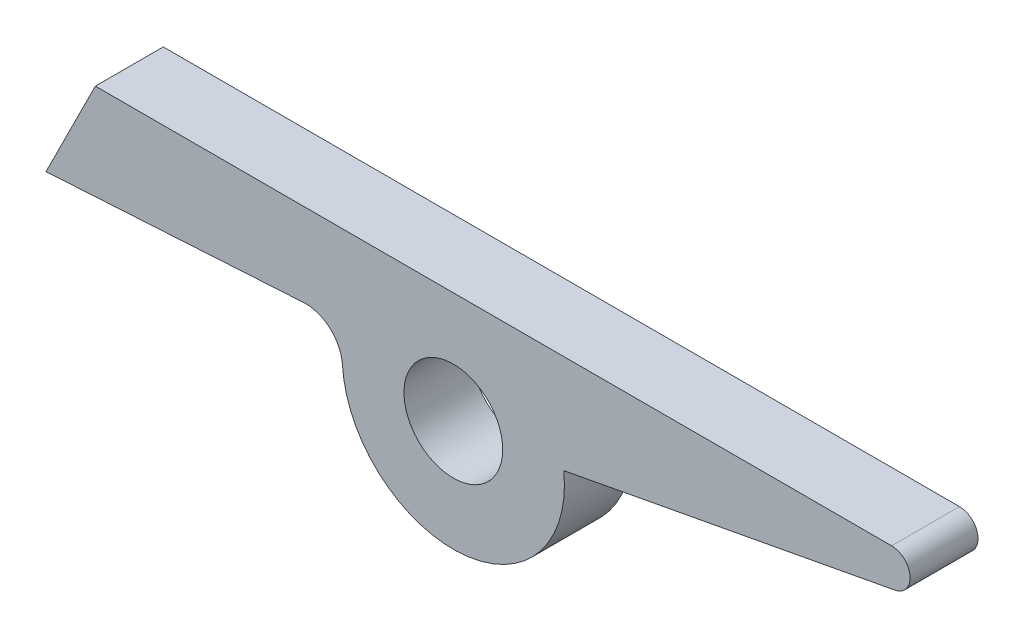
ISO-10303-21;
HEADER;
FILE_DESCRIPTION(('STEP AP214'),'2;1');
FILE_NAME('part.step','',(''),(''),'','','');
FILE_SCHEMA(('AUTOMOTIVE_DESIGN { 1 0 10303 214 1 1 1 1 }'));
ENDSEC;
DATA;
#1=APPLICATION_CONTEXT('core data for automotive mechanical design processes');
#2=APPLICATION_PROTOCOL_DEFINITION('international standard','automotive_design',2000,#1);
#3=PRODUCT_CONTEXT('',#1,'mechanical');
#4=PRODUCT('Part','Part','',(#3));
#5=PRODUCT_RELATED_PRODUCT_CATEGORY('part','',(#4));
#6=PRODUCT_DEFINITION_FORMATION('','',#4);
#7=PRODUCT_DEFINITION_CONTEXT('part definition',#1,'design');
#8=PRODUCT_DEFINITION('design','',#6,#7);
#9=PRODUCT_DEFINITION_SHAPE('','',#8);
#10=(LENGTH_UNIT() NAMED_UNIT(*) SI_UNIT(.MILLI.,.METRE.));
#11=(NAMED_UNIT(*) PLANE_ANGLE_UNIT() SI_UNIT($,.RADIAN.));
#12=(NAMED_UNIT(*) SI_UNIT($,.STERADIAN.) SOLID_ANGLE_UNIT());
#13=UNCERTAINTY_MEASURE_WITH_UNIT(LENGTH_MEASURE(1.E-05),#10,'distance_accuracy_value','');
#14=(GEOMETRIC_REPRESENTATION_CONTEXT(3) GLOBAL_UNCERTAINTY_ASSIGNED_CONTEXT((#13)) GLOBAL_UNIT_ASSIGNED_CONTEXT((#10,
#11,#12)) REPRESENTATION_CONTEXT('',''));
#15=CARTESIAN_POINT('',(0.,0.,0.));
#16=DIRECTION('',(0.,0.,1.));
#17=DIRECTION('',(1.,0.,0.));
#18=AXIS2_PLACEMENT_3D('',#15,#16,#17);
#19=CARTESIAN_POINT('',(-11.9771616003125,-0.740000000000001,5.5));
#20=DIRECTION('',(0.,0.,-1.));
#21=DIRECTION('',(-1.,0.,0.));
#22=AXIS2_PLACEMENT_3D('',#19,#20,#21);
#23=CYLINDRICAL_SURFACE('',#22,3.);
#24=CARTESIAN_POINT('',(-11.9771616003125,-0.740000000000001,0.));
#25=DIRECTION('',(0.,0.,1.));
#26=DIRECTION('',(1.,0.,0.));
#27=AXIS2_PLACEMENT_3D('',#24,#25,#26);
#28=CIRCLE('',#27,3.);
#29=CARTESIAN_POINT('',(-8.98287120023437,-0.555000000000001,0.));
#30=VERTEX_POINT('',#29);
#31=CARTESIAN_POINT('',(-12.3355313920261,2.23851827128643,0.));
#32=VERTEX_POINT('',#31);
#33=EDGE_CURVE('E136',#30,#32,#28,.T.);
#34=ORIENTED_EDGE('',*,*,#33,.F.);
#35=DIRECTION('',(0.,0.,-1.));
#36=VECTOR('',#35,1.);
#37=CARTESIAN_POINT('',(-8.98287120023437,-0.555000000000001,5.5));
#38=LINE('',#37,#36);
#39=CARTESIAN_POINT('',(-8.98287120023437,-0.555000000000001,5.5));
#40=VERTEX_POINT('',#39);
#41=EDGE_CURVE('E11',#40,#30,#38,.T.);
#42=ORIENTED_EDGE('',*,*,#41,.F.);
#43=CARTESIAN_POINT('',(-11.9771616003125,-0.740000000000001,5.5));
#44=DIRECTION('',(0.,0.,1.));
#45=DIRECTION('',(1.,0.,0.));
#46=AXIS2_PLACEMENT_3D('',#43,#44,#45);
#47=CIRCLE('',#46,3.);
#48=CARTESIAN_POINT('',(-12.3355313920261,2.23851827128643,5.5));
#49=VERTEX_POINT('',#48);
#50=EDGE_CURVE('E163',#40,#49,#47,.T.);
#51=ORIENTED_EDGE('',*,*,#50,.T.);
#52=DIRECTION('',(0.,0.,-1.));
#53=VECTOR('',#52,1.);
#54=CARTESIAN_POINT('',(-12.3355313920261,2.23851827128643,5.5));
#55=LINE('',#54,#53);
#56=EDGE_CURVE('E56',#49,#32,#55,.T.);
#57=ORIENTED_EDGE('',*,*,#56,.T.);
#58=EDGE_LOOP('',(#34,#42,#51,#57));
#59=FACE_BOUND('',#58,.T.);
#60=ADVANCED_FACE('F39',(#59),#23,.F.);
#61=CARTESIAN_POINT('',(0.,0.,5.5));
#62=DIRECTION('',(0.,0.,-1.));
#63=DIRECTION('',(-1.,0.,0.));
#64=AXIS2_PLACEMENT_3D('',#61,#62,#63);
#65=CYLINDRICAL_SURFACE('',#64,9.);
#66=CARTESIAN_POINT('',(0.,0.,0.));
#67=DIRECTION('',(0.,0.,1.));
#68=DIRECTION('',(1.,0.,0.));
#69=AXIS2_PLACEMENT_3D('',#66,#67,#68);
#70=CIRCLE('',#69,9.);
#71=CARTESIAN_POINT('',(8.94418427598953,1.00078351162558,0.));
#72=VERTEX_POINT('',#71);
#73=EDGE_CURVE('E139',#30,#72,#70,.T.);
#74=ORIENTED_EDGE('',*,*,#73,.T.);
#75=DIRECTION('',(0.,0.,-1.));
#76=VECTOR('',#75,1.);
#77=CARTESIAN_POINT('',(8.94418427598953,1.00078351162558,5.5));
#78=LINE('',#77,#76);
#79=CARTESIAN_POINT('',(8.94418427598953,1.00078351162558,5.5));
#80=VERTEX_POINT('',#79);
#81=EDGE_CURVE('E48',#80,#72,#78,.T.);
#82=ORIENTED_EDGE('',*,*,#81,.F.);
#83=CARTESIAN_POINT('',(0.,0.,5.5));
#84=DIRECTION('',(0.,0.,1.));
#85=DIRECTION('',(1.,0.,0.));
#86=AXIS2_PLACEMENT_3D('',#83,#84,#85);
#87=CIRCLE('',#86,9.);
#88=EDGE_CURVE('E191',#40,#80,#87,.T.);
#89=ORIENTED_EDGE('',*,*,#88,.F.);
#90=ORIENTED_EDGE('',*,*,#41,.T.);
#91=EDGE_LOOP('',(#74,#82,#89,#90));
#92=FACE_BOUND('',#91,.T.);
#93=ADVANCED_FACE('F209',(#92),#65,.T.);
#94=CARTESIAN_POINT('',(0.121937151796381,-0.651194800227761,5.5));
#95=DIRECTION('',(-0.184052495591897,0.982916414994884,0.));
#96=DIRECTION('',(-0.982916414994884,-0.184052495591897,0.));
#97=AXIS2_PLACEMENT_3D('',#94,#95,#96);
#98=PLANE('',#97);
#99=DIRECTION('',(0.982916414994884,0.184052495591897,0.));
#100=VECTOR('',#99,1.);
#101=CARTESIAN_POINT('',(0.121937151796381,-0.651194800227761,0.));
#102=LINE('',#101,#100);
#103=CARTESIAN_POINT('',(35.7789171430754,6.02562537750767,0.));
#104=VERTEX_POINT('',#103);
#105=EDGE_CURVE('E142',#72,#104,#102,.T.);
#106=ORIENTED_EDGE('',*,*,#105,.T.);
#107=DIRECTION('',(0.,0.,-1.));
#108=VECTOR('',#107,1.);
#109=CARTESIAN_POINT('',(35.7789171430754,6.02562537750767,5.5));
#110=LINE('',#109,#108);
#111=CARTESIAN_POINT('',(35.7789171430754,6.02562537750767,5.5));
#112=VERTEX_POINT('',#111);
#113=EDGE_CURVE('E170',#112,#104,#110,.T.);
#114=ORIENTED_EDGE('',*,*,#113,.F.);
#115=DIRECTION('',(0.982916414994884,0.184052495591897,0.));
#116=VECTOR('',#115,1.);
#117=CARTESIAN_POINT('',(0.121937151796381,-0.651194800227761,5.5));
#118=LINE('',#117,#116);
#119=EDGE_CURVE('E180',#80,#112,#118,.T.);
#120=ORIENTED_EDGE('',*,*,#119,.F.);
#121=ORIENTED_EDGE('',*,*,#81,.T.);
#122=EDGE_LOOP('',(#106,#114,#120,#121));
#123=FACE_BOUND('',#122,.T.);
#124=ADVANCED_FACE('F178',(#123),#98,.F.);
#125=CARTESIAN_POINT('',(35.5028383996875,7.5,5.5));
#126=DIRECTION('',(0.,0.,-1.));
#127=DIRECTION('',(-1.,0.,0.));
#128=AXIS2_PLACEMENT_3D('',#125,#126,#127);
#129=CYLINDRICAL_SURFACE('',#128,1.5);
#130=CARTESIAN_POINT('',(35.5028383996875,7.5,0.));
#131=DIRECTION('',(0.,0.,1.));
#132=DIRECTION('',(1.,0.,0.));
#133=AXIS2_PLACEMENT_3D('',#130,#131,#132);
#134=CIRCLE('',#133,1.5);
#135=CARTESIAN_POINT('',(35.5028383996875,9.,0.));
#136=VERTEX_POINT('',#135);
#137=EDGE_CURVE('E146',#136,#104,#134,.F.);
#138=ORIENTED_EDGE('',*,*,#137,.F.);
#139=DIRECTION('',(0.,0.,-1.));
#140=VECTOR('',#139,1.);
#141=CARTESIAN_POINT('',(35.5028383996875,9.,5.5));
#142=LINE('',#141,#140);
#143=CARTESIAN_POINT('',(35.5028383996875,9.,5.5));
#144=VERTEX_POINT('',#143);
#145=EDGE_CURVE('E110',#144,#136,#142,.T.);
#146=ORIENTED_EDGE('',*,*,#145,.F.);
#147=CARTESIAN_POINT('',(35.5028383996875,7.5,5.5));
#148=DIRECTION('',(0.,0.,1.));
#149=DIRECTION('',(1.,0.,0.));
#150=AXIS2_PLACEMENT_3D('',#147,#148,#149);
#151=CIRCLE('',#150,1.5);
#152=EDGE_CURVE('E121',#144,#112,#151,.F.);
#153=ORIENTED_EDGE('',*,*,#152,.T.);
#154=ORIENTED_EDGE('',*,*,#113,.T.);
#155=EDGE_LOOP('',(#138,#146,#153,#154));
#156=FACE_BOUND('',#155,.T.);
#157=ADVANCED_FACE('F188',(#156),#129,.T.);
#158=CARTESIAN_POINT('',(0.,9.,5.5));
#159=DIRECTION('',(0.,1.,0.));
#160=DIRECTION('',(0.,0.,1.));
#161=AXIS2_PLACEMENT_3D('',#158,#159,#160);
#162=PLANE('',#161);
#163=DIRECTION('',(1.,0.,0.));
#164=VECTOR('',#163,1.);
#165=CARTESIAN_POINT('',(0.,9.,0.));
#166=LINE('',#165,#164);
#167=CARTESIAN_POINT('',(-28.9971616003125,9.,0.));
#168=VERTEX_POINT('',#167);
#169=EDGE_CURVE('E105',#168,#136,#166,.T.);
#170=ORIENTED_EDGE('',*,*,#169,.F.);
#171=DIRECTION('',(0.,0.,-1.));
#172=VECTOR('',#171,1.);
#173=CARTESIAN_POINT('',(-28.9971616003125,9.,5.5));
#174=LINE('',#173,#172);
#175=CARTESIAN_POINT('',(-28.9971616003125,9.,5.5));
#176=VERTEX_POINT('',#175);
#177=EDGE_CURVE('E100',#176,#168,#174,.T.);
#178=ORIENTED_EDGE('',*,*,#177,.F.);
#179=DIRECTION('',(1.,0.,0.));
#180=VECTOR('',#179,1.);
#181=CARTESIAN_POINT('',(0.,9.,5.5));
#182=LINE('',#181,#180);
#183=EDGE_CURVE('E103',#176,#144,#182,.T.);
#184=ORIENTED_EDGE('',*,*,#183,.T.);
#185=ORIENTED_EDGE('',*,*,#145,.T.);
#186=EDGE_LOOP('',(#170,#178,#184,#185));
#187=FACE_BOUND('',#186,.T.);
#188=ADVANCED_FACE('F102',(#187),#162,.T.);
#189=CARTESIAN_POINT('',(-26.79772928025,13.398864640125,5.5));
#190=DIRECTION('',(-0.894427190999916,0.447213595499959,0.));
#191=DIRECTION('',(-0.447213595499959,-0.894427190999916,0.));
#192=AXIS2_PLACEMENT_3D('',#189,#190,#191);
#193=PLANE('',#192);
#194=DIRECTION('',(0.447213595499959,0.894427190999916,0.));
#195=VECTOR('',#194,1.);
#196=CARTESIAN_POINT('',(-26.79772928025,13.398864640125,0.));
#197=LINE('',#196,#195);
#198=CARTESIAN_POINT('',(-32.9971616003125,0.999999999999999,0.));
#199=VERTEX_POINT('',#198);
#200=EDGE_CURVE('E152',#199,#168,#197,.T.);
#201=ORIENTED_EDGE('',*,*,#200,.F.);
#202=DIRECTION('',(0.,0.,-1.));
#203=VECTOR('',#202,1.);
#204=CARTESIAN_POINT('',(-32.9971616003125,0.999999999999999,5.5));
#205=LINE('',#204,#203);
#206=CARTESIAN_POINT('',(-32.9971616003125,0.999999999999999,5.5));
#207=VERTEX_POINT('',#206);
#208=EDGE_CURVE('E78',#207,#199,#205,.T.);
#209=ORIENTED_EDGE('',*,*,#208,.F.);
#210=DIRECTION('',(0.447213595499959,0.894427190999916,0.));
#211=VECTOR('',#210,1.);
#212=CARTESIAN_POINT('',(-26.79772928025,13.398864640125,5.5));
#213=LINE('',#212,#211);
#214=EDGE_CURVE('E119',#207,#176,#213,.T.);
#215=ORIENTED_EDGE('',*,*,#214,.T.);
#216=ORIENTED_EDGE('',*,*,#177,.T.);
#217=EDGE_LOOP('',(#201,#209,#215,#216));
#218=FACE_BOUND('',#217,.T.);
#219=ADVANCED_FACE('F124',(#218),#193,.T.);
#220=CARTESIAN_POINT('',(-0.177867644254887,2.96728403352201,5.5));
#221=DIRECTION('',(0.0598355088465703,-0.998208250757863,0.));
#222=DIRECTION('',(0.998208250757863,0.0598355088465703,0.));
#223=AXIS2_PLACEMENT_3D('',#220,#221,#222);
#224=PLANE('',#223);
#225=DIRECTION('',(-0.998208250757863,-0.0598355088465703,0.));
#226=VECTOR('',#225,1.);
#227=CARTESIAN_POINT('',(-0.177867644254887,2.96728403352201,0.));
#228=LINE('',#227,#226);
#229=EDGE_CURVE('E155',#32,#199,#228,.T.);
#230=ORIENTED_EDGE('',*,*,#229,.F.);
#231=ORIENTED_EDGE('',*,*,#56,.F.);
#232=DIRECTION('',(-0.998208250757863,-0.0598355088465703,0.));
#233=VECTOR('',#232,1.);
#234=CARTESIAN_POINT('',(-0.177867644254887,2.96728403352201,5.5));
#235=LINE('',#234,#233);
#236=EDGE_CURVE('E126',#49,#207,#235,.T.);
#237=ORIENTED_EDGE('',*,*,#236,.T.);
#238=ORIENTED_EDGE('',*,*,#208,.T.);
#239=EDGE_LOOP('',(#230,#231,#237,#238));
#240=FACE_BOUND('',#239,.T.);
#241=ADVANCED_FACE('F197',(#240),#224,.T.);
#242=CARTESIAN_POINT('',(0.,0.,5.5));
#243=DIRECTION('',(0.,0.,-1.));
#244=DIRECTION('',(-1.,0.,0.));
#245=AXIS2_PLACEMENT_3D('',#242,#243,#244);
#246=CYLINDRICAL_SURFACE('',#245,4.);
#247=CARTESIAN_POINT('',(0.,0.,5.5));
#248=DIRECTION('',(0.,0.,1.));
#249=DIRECTION('',(1.,0.,0.));
#250=AXIS2_PLACEMENT_3D('',#247,#248,#249);
#251=CIRCLE('',#250,4.);
#252=CARTESIAN_POINT('',(4.,0.,5.5));
#253=VERTEX_POINT('',#252);
#254=EDGE_CURVE('E129',#253,#253,#251,.T.);
#255=ORIENTED_EDGE('',*,*,#254,.T.);
#256=EDGE_LOOP('',(#255));
#257=FACE_BOUND('',#256,.T.);
#258=CARTESIAN_POINT('',(0.,0.,0.));
#259=DIRECTION('',(0.,0.,1.));
#260=DIRECTION('',(1.,0.,0.));
#261=AXIS2_PLACEMENT_3D('',#258,#259,#260);
#262=CIRCLE('',#261,4.);
#263=CARTESIAN_POINT('',(4.,0.,0.));
#264=VERTEX_POINT('',#263);
#265=EDGE_CURVE('E159',#264,#264,#262,.T.);
#266=ORIENTED_EDGE('',*,*,#265,.F.);
#267=EDGE_LOOP('',(#266));
#268=FACE_BOUND('',#267,.T.);
#269=ADVANCED_FACE('F199',(#257,#268),#246,.F.);
#270=CARTESIAN_POINT('',(0.,0.,5.5));
#271=DIRECTION('',(0.,0.,1.));
#272=DIRECTION('',(1.,0.,0.));
#273=AXIS2_PLACEMENT_3D('',#270,#271,#272);
#274=PLANE('',#273);
#275=ORIENTED_EDGE('',*,*,#50,.F.);
#276=ORIENTED_EDGE('',*,*,#88,.T.);
#277=ORIENTED_EDGE('',*,*,#119,.T.);
#278=ORIENTED_EDGE('',*,*,#152,.F.);
#279=ORIENTED_EDGE('',*,*,#183,.F.);
#280=ORIENTED_EDGE('',*,*,#214,.F.);
#281=ORIENTED_EDGE('',*,*,#236,.F.);
#282=EDGE_LOOP('',(#275,#276,#277,#278,#279,#280,#281));
#283=FACE_BOUND('',#282,.T.);
#284=ORIENTED_EDGE('',*,*,#254,.F.);
#285=EDGE_LOOP('',(#284));
#286=FACE_BOUND('',#285,.T.);
#287=ADVANCED_FACE('F116',(#283,#286),#274,.T.);
#288=CARTESIAN_POINT('',(0.,0.,0.));
#289=DIRECTION('',(0.,0.,1.));
#290=DIRECTION('',(1.,0.,0.));
#291=AXIS2_PLACEMENT_3D('',#288,#289,#290);
#292=PLANE('',#291);
#293=ORIENTED_EDGE('',*,*,#33,.T.);
#294=ORIENTED_EDGE('',*,*,#229,.T.);
#295=ORIENTED_EDGE('',*,*,#200,.T.);
#296=ORIENTED_EDGE('',*,*,#169,.T.);
#297=ORIENTED_EDGE('',*,*,#137,.T.);
#298=ORIENTED_EDGE('',*,*,#105,.F.);
#299=ORIENTED_EDGE('',*,*,#73,.F.);
#300=EDGE_LOOP('',(#293,#294,#295,#296,#297,#298,#299));
#301=FACE_BOUND('',#300,.T.);
#302=ORIENTED_EDGE('',*,*,#265,.T.);
#303=EDGE_LOOP('',(#302));
#304=FACE_BOUND('',#303,.T.);
#305=ADVANCED_FACE('F184',(#301,#304),#292,.F.);
#306=CLOSED_SHELL('',(#60,#93,#124,#157,#188,#219,#241,#269,#287,#305));
#307=MANIFOLD_SOLID_BREP('B2',#306);
#308=ADVANCED_BREP_SHAPE_REPRESENTATION('',(#18,#307),#14);
#309=SHAPE_DEFINITION_REPRESENTATION(#9,#308);
ENDSEC;
END-ISO-10303-21;
